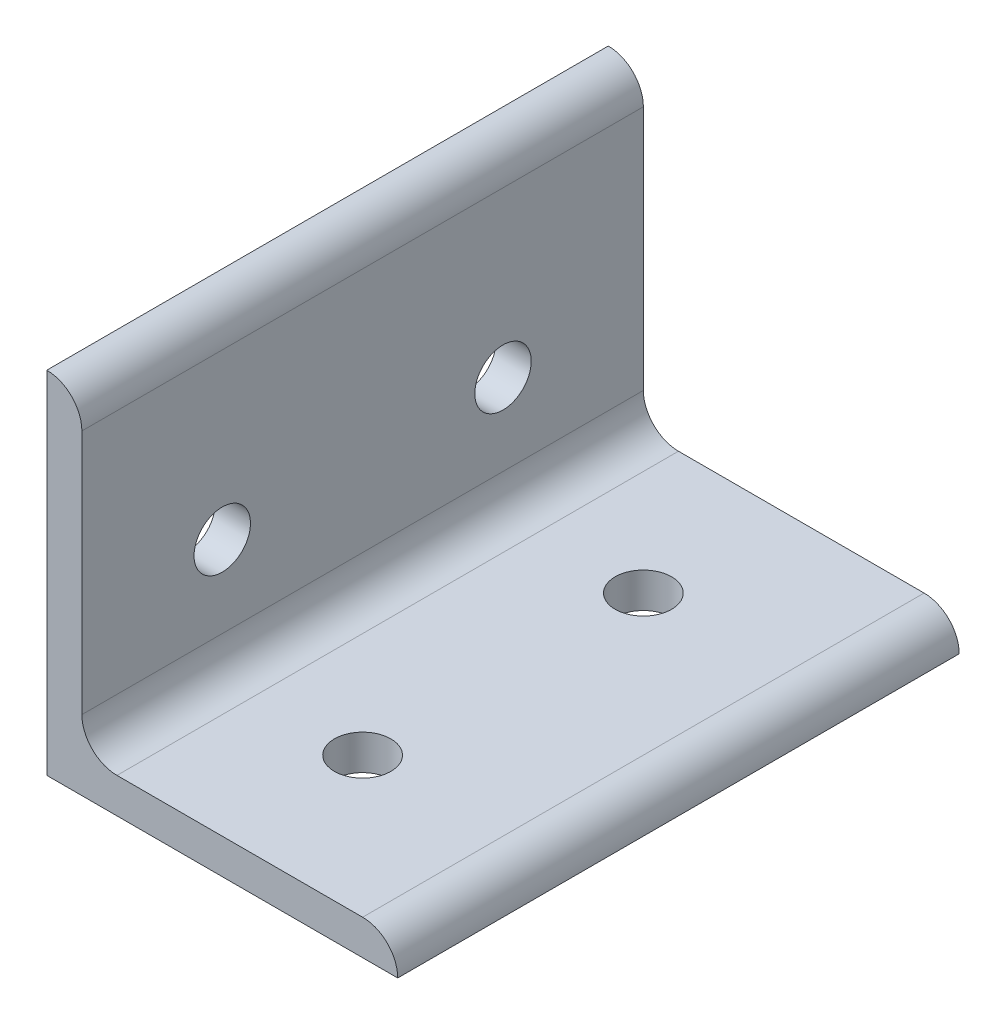
ISO-10303-21;
HEADER;
FILE_DESCRIPTION(('STEP AP214'),'2;1');
FILE_NAME('part.step','',(''),(''),'','','');
FILE_SCHEMA(('AUTOMOTIVE_DESIGN { 1 0 10303 214 1 1 1 1 }'));
ENDSEC;
DATA;
#1=APPLICATION_CONTEXT('core data for automotive mechanical design processes');
#2=APPLICATION_PROTOCOL_DEFINITION('international standard','automotive_design',2000,#1);
#3=PRODUCT_CONTEXT('',#1,'mechanical');
#4=PRODUCT('Part','Part','',(#3));
#5=PRODUCT_RELATED_PRODUCT_CATEGORY('part','',(#4));
#6=PRODUCT_DEFINITION_FORMATION('','',#4);
#7=PRODUCT_DEFINITION_CONTEXT('part definition',#1,'design');
#8=PRODUCT_DEFINITION('design','',#6,#7);
#9=PRODUCT_DEFINITION_SHAPE('','',#8);
#10=(LENGTH_UNIT() NAMED_UNIT(*) SI_UNIT(.MILLI.,.METRE.));
#11=(NAMED_UNIT(*) PLANE_ANGLE_UNIT() SI_UNIT($,.RADIAN.));
#12=(NAMED_UNIT(*) SI_UNIT($,.STERADIAN.) SOLID_ANGLE_UNIT());
#13=UNCERTAINTY_MEASURE_WITH_UNIT(LENGTH_MEASURE(1.E-05),#10,'distance_accuracy_value','');
#14=(GEOMETRIC_REPRESENTATION_CONTEXT(3) GLOBAL_UNCERTAINTY_ASSIGNED_CONTEXT((#13)) GLOBAL_UNIT_ASSIGNED_CONTEXT((#10,
#11,#12)) REPRESENTATION_CONTEXT('',''));
#15=CARTESIAN_POINT('',(0.,0.,0.));
#16=DIRECTION('',(0.,0.,1.));
#17=DIRECTION('',(1.,0.,0.));
#18=AXIS2_PLACEMENT_3D('',#15,#16,#17);
#19=CARTESIAN_POINT('',(0.,0.,25.4));
#20=DIRECTION('',(0.,1.,0.));
#21=DIRECTION('',(0.,0.,1.));
#22=AXIS2_PLACEMENT_3D('',#19,#20,#21);
#23=PLANE('',#22);
#24=CARTESIAN_POINT('',(15.875,0.,-12.7));
#25=DIRECTION('',(0.,-1.,0.));
#26=DIRECTION('',(0.,0.,-1.));
#27=AXIS2_PLACEMENT_3D('',#24,#25,#26);
#28=CIRCLE('',#27,2.5527);
#29=CARTESIAN_POINT('',(15.875,0.,-15.2527));
#30=VERTEX_POINT('',#29);
#31=EDGE_CURVE('E164',#30,#30,#28,.T.);
#32=ORIENTED_EDGE('',*,*,#31,.F.);
#33=EDGE_LOOP('',(#32));
#34=FACE_BOUND('',#33,.T.);
#35=CARTESIAN_POINT('',(15.875,0.,12.7));
#36=DIRECTION('',(0.,-1.,0.));
#37=DIRECTION('',(0.,0.,-1.));
#38=AXIS2_PLACEMENT_3D('',#35,#36,#37);
#39=CIRCLE('',#38,2.5527);
#40=CARTESIAN_POINT('',(15.875,0.,10.1473));
#41=VERTEX_POINT('',#40);
#42=EDGE_CURVE('E160',#41,#41,#39,.T.);
#43=ORIENTED_EDGE('',*,*,#42,.F.);
#44=EDGE_LOOP('',(#43));
#45=FACE_BOUND('',#44,.T.);
#46=DIRECTION('',(1.,0.,0.));
#47=VECTOR('',#46,1.);
#48=CARTESIAN_POINT('',(0.,0.,-25.4));
#49=LINE('',#48,#47);
#50=CARTESIAN_POINT('',(0.,0.,-25.4));
#51=VERTEX_POINT('',#50);
#52=CARTESIAN_POINT('',(31.75,0.,-25.4));
#53=VERTEX_POINT('',#52);
#54=EDGE_CURVE('E106',#51,#53,#49,.T.);
#55=ORIENTED_EDGE('',*,*,#54,.T.);
#56=DIRECTION('',(0.,0.,-1.));
#57=VECTOR('',#56,1.);
#58=CARTESIAN_POINT('',(31.75,0.,25.4));
#59=LINE('',#58,#57);
#60=CARTESIAN_POINT('',(31.75,0.,25.4));
#61=VERTEX_POINT('',#60);
#62=EDGE_CURVE('E104',#61,#53,#59,.T.);
#63=ORIENTED_EDGE('',*,*,#62,.F.);
#64=DIRECTION('',(1.,0.,0.));
#65=VECTOR('',#64,1.);
#66=CARTESIAN_POINT('',(0.,0.,25.4));
#67=LINE('',#66,#65);
#68=CARTESIAN_POINT('',(0.,0.,25.4));
#69=VERTEX_POINT('',#68);
#70=EDGE_CURVE('E90',#69,#61,#67,.T.);
#71=ORIENTED_EDGE('',*,*,#70,.F.);
#72=DIRECTION('',(0.,0.,-1.));
#73=VECTOR('',#72,1.);
#74=CARTESIAN_POINT('',(0.,0.,25.4));
#75=LINE('',#74,#73);
#76=EDGE_CURVE('E145',#69,#51,#75,.T.);
#77=ORIENTED_EDGE('',*,*,#76,.T.);
#78=EDGE_LOOP('',(#55,#63,#71,#77));
#79=FACE_BOUND('',#78,.T.);
#80=ADVANCED_FACE('F33',(#34,#45,#79),#23,.F.);
#81=CARTESIAN_POINT('',(3.175,3.175,25.4));
#82=DIRECTION('',(0.,-1.,0.));
#83=DIRECTION('',(0.,0.,-1.));
#84=AXIS2_PLACEMENT_3D('',#81,#82,#83);
#85=PLANE('',#84);
#86=CARTESIAN_POINT('',(15.875,3.175,-12.7));
#87=DIRECTION('',(0.,-1.,0.));
#88=DIRECTION('',(0.,0.,-1.));
#89=AXIS2_PLACEMENT_3D('',#86,#87,#88);
#90=CIRCLE('',#89,2.5527);
#91=CARTESIAN_POINT('',(15.875,3.175,-15.2527));
#92=VERTEX_POINT('',#91);
#93=EDGE_CURVE('E161',#92,#92,#90,.T.);
#94=ORIENTED_EDGE('',*,*,#93,.T.);
#95=EDGE_LOOP('',(#94));
#96=FACE_BOUND('',#95,.T.);
#97=CARTESIAN_POINT('',(15.875,3.175,12.7));
#98=DIRECTION('',(0.,-1.,0.));
#99=DIRECTION('',(0.,0.,-1.));
#100=AXIS2_PLACEMENT_3D('',#97,#98,#99);
#101=CIRCLE('',#100,2.5527);
#102=CARTESIAN_POINT('',(15.875,3.175,10.1473));
#103=VERTEX_POINT('',#102);
#104=EDGE_CURVE('E156',#103,#103,#101,.T.);
#105=ORIENTED_EDGE('',*,*,#104,.T.);
#106=EDGE_LOOP('',(#105));
#107=FACE_BOUND('',#106,.T.);
#108=DIRECTION('',(-1.,0.,0.));
#109=VECTOR('',#108,1.);
#110=CARTESIAN_POINT('',(3.175,3.175,25.4));
#111=LINE('',#110,#109);
#112=CARTESIAN_POINT('',(28.575,3.175,25.4));
#113=VERTEX_POINT('',#112);
#114=CARTESIAN_POINT('',(6.35,3.175,25.4));
#115=VERTEX_POINT('',#114);
#116=EDGE_CURVE('E99',#113,#115,#111,.T.);
#117=ORIENTED_EDGE('',*,*,#116,.F.);
#118=DIRECTION('',(0.,0.,-1.));
#119=VECTOR('',#118,1.);
#120=CARTESIAN_POINT('',(28.575,3.175,25.4));
#121=LINE('',#120,#119);
#122=CARTESIAN_POINT('',(28.575,3.175,-25.4));
#123=VERTEX_POINT('',#122);
#124=EDGE_CURVE('E114',#113,#123,#121,.T.);
#125=ORIENTED_EDGE('',*,*,#124,.T.);
#126=DIRECTION('',(-1.,0.,0.));
#127=VECTOR('',#126,1.);
#128=CARTESIAN_POINT('',(3.175,3.175,-25.4));
#129=LINE('',#128,#127);
#130=CARTESIAN_POINT('',(6.35,3.175,-25.4));
#131=VERTEX_POINT('',#130);
#132=EDGE_CURVE('E129',#123,#131,#129,.T.);
#133=ORIENTED_EDGE('',*,*,#132,.T.);
#134=DIRECTION('',(0.,0.,-1.));
#135=VECTOR('',#134,1.);
#136=CARTESIAN_POINT('',(6.35,3.175,25.4));
#137=LINE('',#136,#135);
#138=EDGE_CURVE('E48',#131,#115,#137,.F.);
#139=ORIENTED_EDGE('',*,*,#138,.T.);
#140=EDGE_LOOP('',(#117,#125,#133,#139));
#141=FACE_BOUND('',#140,.T.);
#142=ADVANCED_FACE('F135',(#96,#107,#141),#85,.F.);
#143=CARTESIAN_POINT('',(3.175,31.75,25.4));
#144=DIRECTION('',(-1.,0.,0.));
#145=DIRECTION('',(0.,-1.,0.));
#146=AXIS2_PLACEMENT_3D('',#143,#144,#145);
#147=PLANE('',#146);
#148=CARTESIAN_POINT('',(3.175,13.716,12.7));
#149=DIRECTION('',(-1.,0.,0.));
#150=DIRECTION('',(0.,-1.,0.));
#151=AXIS2_PLACEMENT_3D('',#148,#149,#150);
#152=CIRCLE('',#151,2.5527);
#153=CARTESIAN_POINT('',(3.175,11.1633,12.7));
#154=VERTEX_POINT('',#153);
#155=EDGE_CURVE('E302',#154,#154,#152,.T.);
#156=ORIENTED_EDGE('',*,*,#155,.T.);
#157=EDGE_LOOP('',(#156));
#158=FACE_BOUND('',#157,.T.);
#159=CARTESIAN_POINT('',(3.175,13.716,-12.7));
#160=DIRECTION('',(-1.,0.,0.));
#161=DIRECTION('',(0.,-1.,0.));
#162=AXIS2_PLACEMENT_3D('',#159,#160,#161);
#163=CIRCLE('',#162,2.5527);
#164=CARTESIAN_POINT('',(3.175,11.1633,-12.7));
#165=VERTEX_POINT('',#164);
#166=EDGE_CURVE('E149',#165,#165,#163,.T.);
#167=ORIENTED_EDGE('',*,*,#166,.T.);
#168=EDGE_LOOP('',(#167));
#169=FACE_BOUND('',#168,.T.);
#170=DIRECTION('',(0.,1.,0.));
#171=VECTOR('',#170,1.);
#172=CARTESIAN_POINT('',(3.175,31.75,-25.4));
#173=LINE('',#172,#171);
#174=CARTESIAN_POINT('',(3.175,6.35,-25.4));
#175=VERTEX_POINT('',#174);
#176=CARTESIAN_POINT('',(3.175,28.575,-25.4));
#177=VERTEX_POINT('',#176);
#178=EDGE_CURVE('E131',#175,#177,#173,.T.);
#179=ORIENTED_EDGE('',*,*,#178,.T.);
#180=DIRECTION('',(0.,0.,-1.));
#181=VECTOR('',#180,1.);
#182=CARTESIAN_POINT('',(3.175,28.575,25.4));
#183=LINE('',#182,#181);
#184=CARTESIAN_POINT('',(3.175,28.575,25.4));
#185=VERTEX_POINT('',#184);
#186=EDGE_CURVE('E116',#177,#185,#183,.F.);
#187=ORIENTED_EDGE('',*,*,#186,.T.);
#188=DIRECTION('',(0.,1.,0.));
#189=VECTOR('',#188,1.);
#190=CARTESIAN_POINT('',(3.175,31.75,25.4));
#191=LINE('',#190,#189);
#192=CARTESIAN_POINT('',(3.175,6.35,25.4));
#193=VERTEX_POINT('',#192);
#194=EDGE_CURVE('E139',#193,#185,#191,.T.);
#195=ORIENTED_EDGE('',*,*,#194,.F.);
#196=DIRECTION('',(0.,0.,-1.));
#197=VECTOR('',#196,1.);
#198=CARTESIAN_POINT('',(3.175,6.35,-25.4));
#199=LINE('',#198,#197);
#200=EDGE_CURVE('E119',#193,#175,#199,.T.);
#201=ORIENTED_EDGE('',*,*,#200,.T.);
#202=EDGE_LOOP('',(#179,#187,#195,#201));
#203=FACE_BOUND('',#202,.T.);
#204=ADVANCED_FACE('F142',(#158,#169,#203),#147,.F.);
#205=CARTESIAN_POINT('',(0.,0.,25.4));
#206=DIRECTION('',(1.,0.,0.));
#207=DIRECTION('',(0.,0.,-1.));
#208=AXIS2_PLACEMENT_3D('',#205,#206,#207);
#209=PLANE('',#208);
#210=CARTESIAN_POINT('',(0.,13.716,12.7));
#211=DIRECTION('',(-1.,0.,0.));
#212=DIRECTION('',(0.,0.,1.));
#213=AXIS2_PLACEMENT_3D('',#210,#211,#212);
#214=CIRCLE('',#213,2.5527);
#215=CARTESIAN_POINT('',(0.,13.716,15.2527));
#216=VERTEX_POINT('',#215);
#217=EDGE_CURVE('E159',#216,#216,#214,.T.);
#218=ORIENTED_EDGE('',*,*,#217,.F.);
#219=EDGE_LOOP('',(#218));
#220=FACE_BOUND('',#219,.T.);
#221=CARTESIAN_POINT('',(0.,13.716,-12.7));
#222=DIRECTION('',(-1.,0.,0.));
#223=DIRECTION('',(0.,0.,1.));
#224=AXIS2_PLACEMENT_3D('',#221,#222,#223);
#225=CIRCLE('',#224,2.5527);
#226=CARTESIAN_POINT('',(0.,13.716,-10.1473));
#227=VERTEX_POINT('',#226);
#228=EDGE_CURVE('E305',#227,#227,#225,.T.);
#229=ORIENTED_EDGE('',*,*,#228,.F.);
#230=EDGE_LOOP('',(#229));
#231=FACE_BOUND('',#230,.T.);
#232=DIRECTION('',(0.,-1.,0.));
#233=VECTOR('',#232,1.);
#234=CARTESIAN_POINT('',(0.,0.,-25.4));
#235=LINE('',#234,#233);
#236=CARTESIAN_POINT('',(0.,31.75,-25.4));
#237=VERTEX_POINT('',#236);
#238=EDGE_CURVE('E100',#237,#51,#235,.T.);
#239=ORIENTED_EDGE('',*,*,#238,.T.);
#240=ORIENTED_EDGE('',*,*,#76,.F.);
#241=DIRECTION('',(0.,-1.,0.));
#242=VECTOR('',#241,1.);
#243=CARTESIAN_POINT('',(0.,0.,25.4));
#244=LINE('',#243,#242);
#245=CARTESIAN_POINT('',(0.,31.75,25.4));
#246=VERTEX_POINT('',#245);
#247=EDGE_CURVE('E95',#246,#69,#244,.T.);
#248=ORIENTED_EDGE('',*,*,#247,.F.);
#249=DIRECTION('',(0.,0.,-1.));
#250=VECTOR('',#249,1.);
#251=CARTESIAN_POINT('',(0.,31.75,25.4));
#252=LINE('',#251,#250);
#253=EDGE_CURVE('E109',#246,#237,#252,.T.);
#254=ORIENTED_EDGE('',*,*,#253,.T.);
#255=EDGE_LOOP('',(#239,#240,#248,#254));
#256=FACE_BOUND('',#255,.T.);
#257=ADVANCED_FACE('F171',(#220,#231,#256),#209,.F.);
#258=CARTESIAN_POINT('',(0.,0.,25.4));
#259=DIRECTION('',(0.,0.,-1.));
#260=DIRECTION('',(-1.,0.,0.));
#261=AXIS2_PLACEMENT_3D('',#258,#259,#260);
#262=PLANE('',#261);
#263=ORIENTED_EDGE('',*,*,#194,.T.);
#264=CARTESIAN_POINT('',(0.,28.575,25.4));
#265=DIRECTION('',(0.,0.,-1.));
#266=DIRECTION('',(-1.,0.,0.));
#267=AXIS2_PLACEMENT_3D('',#264,#265,#266);
#268=CIRCLE('',#267,3.175);
#269=EDGE_CURVE('E115',#185,#246,#268,.F.);
#270=ORIENTED_EDGE('',*,*,#269,.T.);
#271=ORIENTED_EDGE('',*,*,#247,.T.);
#272=ORIENTED_EDGE('',*,*,#70,.T.);
#273=CARTESIAN_POINT('',(28.575,0.,25.4));
#274=DIRECTION('',(0.,0.,-1.));
#275=DIRECTION('',(-1.,0.,0.));
#276=AXIS2_PLACEMENT_3D('',#273,#274,#275);
#277=CIRCLE('',#276,3.175);
#278=EDGE_CURVE('E55',#61,#113,#277,.F.);
#279=ORIENTED_EDGE('',*,*,#278,.T.);
#280=ORIENTED_EDGE('',*,*,#116,.T.);
#281=CARTESIAN_POINT('',(6.35,6.35,25.4));
#282=DIRECTION('',(0.,0.,-1.));
#283=DIRECTION('',(-1.,0.,0.));
#284=AXIS2_PLACEMENT_3D('',#281,#282,#283);
#285=CIRCLE('',#284,3.175);
#286=EDGE_CURVE('E11',#115,#193,#285,.T.);
#287=ORIENTED_EDGE('',*,*,#286,.T.);
#288=EDGE_LOOP('',(#263,#270,#271,#272,#279,#280,#287));
#289=FACE_BOUND('',#288,.T.);
#290=ADVANCED_FACE('F93',(#289),#262,.F.);
#291=CARTESIAN_POINT('',(0.,0.,-25.4));
#292=DIRECTION('',(0.,0.,-1.));
#293=DIRECTION('',(-1.,0.,0.));
#294=AXIS2_PLACEMENT_3D('',#291,#292,#293);
#295=PLANE('',#294);
#296=ORIENTED_EDGE('',*,*,#238,.F.);
#297=CARTESIAN_POINT('',(0.,28.575,-25.4));
#298=DIRECTION('',(0.,0.,-1.));
#299=DIRECTION('',(-1.,0.,0.));
#300=AXIS2_PLACEMENT_3D('',#297,#298,#299);
#301=CIRCLE('',#300,3.175);
#302=EDGE_CURVE('E166',#237,#177,#301,.T.);
#303=ORIENTED_EDGE('',*,*,#302,.T.);
#304=ORIENTED_EDGE('',*,*,#178,.F.);
#305=CARTESIAN_POINT('',(6.35,6.35,-25.4));
#306=DIRECTION('',(0.,0.,-1.));
#307=DIRECTION('',(-1.,0.,0.));
#308=AXIS2_PLACEMENT_3D('',#305,#306,#307);
#309=CIRCLE('',#308,3.175);
#310=EDGE_CURVE('E41',#175,#131,#309,.F.);
#311=ORIENTED_EDGE('',*,*,#310,.T.);
#312=ORIENTED_EDGE('',*,*,#132,.F.);
#313=CARTESIAN_POINT('',(28.575,0.,-25.4));
#314=DIRECTION('',(0.,0.,-1.));
#315=DIRECTION('',(-1.,0.,0.));
#316=AXIS2_PLACEMENT_3D('',#313,#314,#315);
#317=CIRCLE('',#316,3.175);
#318=EDGE_CURVE('E108',#123,#53,#317,.T.);
#319=ORIENTED_EDGE('',*,*,#318,.T.);
#320=ORIENTED_EDGE('',*,*,#54,.F.);
#321=EDGE_LOOP('',(#296,#303,#304,#311,#312,#319,#320));
#322=FACE_BOUND('',#321,.T.);
#323=ADVANCED_FACE('F128',(#322),#295,.T.);
#324=CARTESIAN_POINT('',(31.75,13.716,-12.7));
#325=DIRECTION('',(-1.,0.,0.));
#326=DIRECTION('',(0.,0.,1.));
#327=AXIS2_PLACEMENT_3D('',#324,#325,#326);
#328=CYLINDRICAL_SURFACE('',#327,2.5527);
#329=ORIENTED_EDGE('',*,*,#228,.T.);
#330=EDGE_LOOP('',(#329));
#331=FACE_BOUND('',#330,.T.);
#332=ORIENTED_EDGE('',*,*,#166,.F.);
#333=EDGE_LOOP('',(#332));
#334=FACE_BOUND('',#333,.T.);
#335=ADVANCED_FACE('F224',(#331,#334),#328,.F.);
#336=CARTESIAN_POINT('',(31.75,13.716,12.7));
#337=DIRECTION('',(-1.,0.,0.));
#338=DIRECTION('',(0.,0.,1.));
#339=AXIS2_PLACEMENT_3D('',#336,#337,#338);
#340=CYLINDRICAL_SURFACE('',#339,2.5527);
#341=ORIENTED_EDGE('',*,*,#217,.T.);
#342=EDGE_LOOP('',(#341));
#343=FACE_BOUND('',#342,.T.);
#344=ORIENTED_EDGE('',*,*,#155,.F.);
#345=EDGE_LOOP('',(#344));
#346=FACE_BOUND('',#345,.T.);
#347=ADVANCED_FACE('F261',(#343,#346),#340,.F.);
#348=CARTESIAN_POINT('',(15.875,31.75,12.7));
#349=DIRECTION('',(0.,-1.,0.));
#350=DIRECTION('',(0.,0.,-1.));
#351=AXIS2_PLACEMENT_3D('',#348,#349,#350);
#352=CYLINDRICAL_SURFACE('',#351,2.5527);
#353=ORIENTED_EDGE('',*,*,#42,.T.);
#354=EDGE_LOOP('',(#353));
#355=FACE_BOUND('',#354,.T.);
#356=ORIENTED_EDGE('',*,*,#104,.F.);
#357=EDGE_LOOP('',(#356));
#358=FACE_BOUND('',#357,.T.);
#359=ADVANCED_FACE('F270',(#355,#358),#352,.F.);
#360=CARTESIAN_POINT('',(15.875,31.75,-12.7));
#361=DIRECTION('',(0.,-1.,0.));
#362=DIRECTION('',(0.,0.,-1.));
#363=AXIS2_PLACEMENT_3D('',#360,#361,#362);
#364=CYLINDRICAL_SURFACE('',#363,2.5527);
#365=ORIENTED_EDGE('',*,*,#31,.T.);
#366=EDGE_LOOP('',(#365));
#367=FACE_BOUND('',#366,.T.);
#368=ORIENTED_EDGE('',*,*,#93,.F.);
#369=EDGE_LOOP('',(#368));
#370=FACE_BOUND('',#369,.T.);
#371=ADVANCED_FACE('F198',(#367,#370),#364,.F.);
#372=CARTESIAN_POINT('',(0.,28.575,25.4));
#373=DIRECTION('',(0.,0.,-1.));
#374=DIRECTION('',(-1.,0.,0.));
#375=AXIS2_PLACEMENT_3D('',#372,#373,#374);
#376=CYLINDRICAL_SURFACE('',#375,3.175);
#377=ORIENTED_EDGE('',*,*,#269,.F.);
#378=ORIENTED_EDGE('',*,*,#186,.F.);
#379=ORIENTED_EDGE('',*,*,#302,.F.);
#380=ORIENTED_EDGE('',*,*,#253,.F.);
#381=EDGE_LOOP('',(#377,#378,#379,#380));
#382=FACE_BOUND('',#381,.T.);
#383=ADVANCED_FACE('F169',(#382),#376,.T.);
#384=CARTESIAN_POINT('',(28.575,0.,25.4));
#385=DIRECTION('',(0.,0.,-1.));
#386=DIRECTION('',(-1.,0.,0.));
#387=AXIS2_PLACEMENT_3D('',#384,#385,#386);
#388=CYLINDRICAL_SURFACE('',#387,3.175);
#389=ORIENTED_EDGE('',*,*,#278,.F.);
#390=ORIENTED_EDGE('',*,*,#62,.T.);
#391=ORIENTED_EDGE('',*,*,#318,.F.);
#392=ORIENTED_EDGE('',*,*,#124,.F.);
#393=EDGE_LOOP('',(#389,#390,#391,#392));
#394=FACE_BOUND('',#393,.T.);
#395=ADVANCED_FACE('F112',(#394),#388,.T.);
#396=CARTESIAN_POINT('',(6.35,6.35,25.4));
#397=DIRECTION('',(0.,0.,1.));
#398=DIRECTION('',(1.,0.,0.));
#399=AXIS2_PLACEMENT_3D('',#396,#397,#398);
#400=CYLINDRICAL_SURFACE('',#399,3.175);
#401=ORIENTED_EDGE('',*,*,#286,.F.);
#402=ORIENTED_EDGE('',*,*,#138,.F.);
#403=ORIENTED_EDGE('',*,*,#310,.F.);
#404=ORIENTED_EDGE('',*,*,#200,.F.);
#405=EDGE_LOOP('',(#401,#402,#403,#404));
#406=FACE_BOUND('',#405,.T.);
#407=ADVANCED_FACE('F35',(#406),#400,.F.);
#408=CLOSED_SHELL('',(#80,#142,#204,#257,#290,#323,#335,#347,#359,#371,#383,#395,#407));
#409=MANIFOLD_SOLID_BREP('B2',#408);
#410=ADVANCED_BREP_SHAPE_REPRESENTATION('',(#18,#409),#14);
#411=SHAPE_DEFINITION_REPRESENTATION(#9,#410);
ENDSEC;
END-ISO-10303-21;
